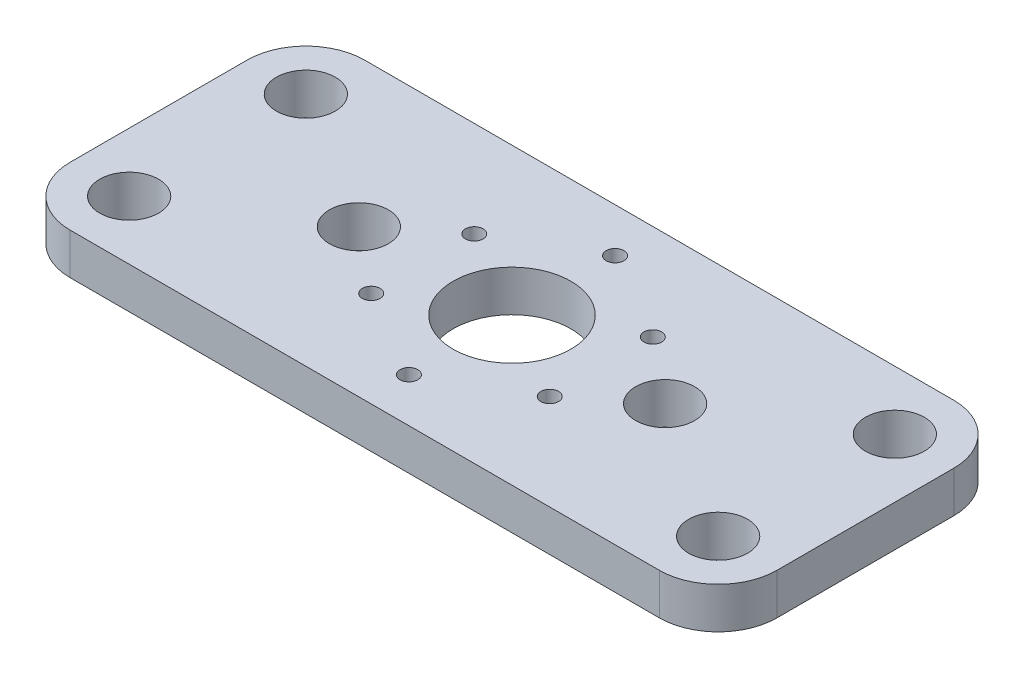
ISO-10303-21;
HEADER;
FILE_DESCRIPTION(('STEP AP214'),'2;1');
FILE_NAME('part.step','',(''),(''),'','','');
FILE_SCHEMA(('AUTOMOTIVE_DESIGN { 1 0 10303 214 1 1 1 1 }'));
ENDSEC;
DATA;
#1=APPLICATION_CONTEXT('core data for automotive mechanical design processes');
#2=APPLICATION_PROTOCOL_DEFINITION('international standard','automotive_design',2000,#1);
#3=PRODUCT_CONTEXT('',#1,'mechanical');
#4=PRODUCT('Part','Part','',(#3));
#5=PRODUCT_RELATED_PRODUCT_CATEGORY('part','',(#4));
#6=PRODUCT_DEFINITION_FORMATION('','',#4);
#7=PRODUCT_DEFINITION_CONTEXT('part definition',#1,'design');
#8=PRODUCT_DEFINITION('design','',#6,#7);
#9=PRODUCT_DEFINITION_SHAPE('','',#8);
#10=(LENGTH_UNIT() NAMED_UNIT(*) SI_UNIT(.MILLI.,.METRE.));
#11=(NAMED_UNIT(*) PLANE_ANGLE_UNIT() SI_UNIT($,.RADIAN.));
#12=(NAMED_UNIT(*) SI_UNIT($,.STERADIAN.) SOLID_ANGLE_UNIT());
#13=UNCERTAINTY_MEASURE_WITH_UNIT(LENGTH_MEASURE(1.E-05),#10,'distance_accuracy_value','');
#14=(GEOMETRIC_REPRESENTATION_CONTEXT(3) GLOBAL_UNCERTAINTY_ASSIGNED_CONTEXT((#13)) GLOBAL_UNIT_ASSIGNED_CONTEXT((#10,
#11,#12)) REPRESENTATION_CONTEXT('',''));
#15=CARTESIAN_POINT('',(0.,0.,0.));
#16=DIRECTION('',(0.,0.,1.));
#17=DIRECTION('',(1.,0.,0.));
#18=AXIS2_PLACEMENT_3D('',#15,#16,#17);
#19=CARTESIAN_POINT('',(50.,7.,15.));
#20=DIRECTION('',(0.,1.,0.));
#21=DIRECTION('',(0.,0.,1.));
#22=AXIS2_PLACEMENT_3D('',#19,#20,#21);
#23=PLANE('',#22);
#24=CARTESIAN_POINT('',(-15.1554445662278,7.,8.74999999999986));
#25=DIRECTION('',(0.,1.,0.));
#26=DIRECTION('',(0.,0.,1.));
#27=AXIS2_PLACEMENT_3D('',#24,#25,#26);
#28=CIRCLE('',#27,1.5);
#29=CARTESIAN_POINT('',(-15.1554445662278,7.,10.2499999999999));
#30=VERTEX_POINT('',#29);
#31=EDGE_CURVE('E246',#30,#30,#28,.T.);
#32=ORIENTED_EDGE('',*,*,#31,.F.);
#33=EDGE_LOOP('',(#32));
#34=FACE_BOUND('',#33,.T.);
#35=CARTESIAN_POINT('',(15.1554445662278,7.,8.75000000000038));
#36=DIRECTION('',(0.,1.,0.));
#37=DIRECTION('',(0.,0.,1.));
#38=AXIS2_PLACEMENT_3D('',#35,#36,#37);
#39=CIRCLE('',#38,1.49999999999973);
#40=CARTESIAN_POINT('',(15.1554445662278,7.,10.2500000000001));
#41=VERTEX_POINT('',#40);
#42=EDGE_CURVE('E234',#41,#41,#39,.T.);
#43=ORIENTED_EDGE('',*,*,#42,.F.);
#44=EDGE_LOOP('',(#43));
#45=FACE_BOUND('',#44,.T.);
#46=CARTESIAN_POINT('',(50.,7.,-15.));
#47=DIRECTION('',(0.,1.,0.));
#48=DIRECTION('',(0.,0.,1.));
#49=AXIS2_PLACEMENT_3D('',#46,#47,#48);
#50=CIRCLE('',#49,5.);
#51=CARTESIAN_POINT('',(50.,7.,-9.99999999999999));
#52=VERTEX_POINT('',#51);
#53=EDGE_CURVE('E222',#52,#52,#50,.T.);
#54=ORIENTED_EDGE('',*,*,#53,.F.);
#55=EDGE_LOOP('',(#54));
#56=FACE_BOUND('',#55,.T.);
#57=CARTESIAN_POINT('',(-49.9999999999171,7.,15.));
#58=DIRECTION('',(0.,1.,0.));
#59=DIRECTION('',(0.,0.,1.));
#60=AXIS2_PLACEMENT_3D('',#57,#58,#59);
#61=CIRCLE('',#60,5.);
#62=CARTESIAN_POINT('',(-49.9999999999171,7.,20.));
#63=VERTEX_POINT('',#62);
#64=EDGE_CURVE('E210',#63,#63,#61,.T.);
#65=ORIENTED_EDGE('',*,*,#64,.F.);
#66=EDGE_LOOP('',(#65));
#67=FACE_BOUND('',#66,.T.);
#68=CARTESIAN_POINT('',(26.,7.,0.));
#69=DIRECTION('',(0.,1.,0.));
#70=DIRECTION('',(0.,0.,1.));
#71=AXIS2_PLACEMENT_3D('',#68,#69,#70);
#72=CIRCLE('',#71,5.);
#73=CARTESIAN_POINT('',(26.,7.,5.));
#74=VERTEX_POINT('',#73);
#75=EDGE_CURVE('E198',#74,#74,#72,.T.);
#76=ORIENTED_EDGE('',*,*,#75,.F.);
#77=EDGE_LOOP('',(#76));
#78=FACE_BOUND('',#77,.T.);
#79=CARTESIAN_POINT('',(0.,7.,-17.5));
#80=DIRECTION('',(0.,1.,0.));
#81=DIRECTION('',(0.,0.,1.));
#82=AXIS2_PLACEMENT_3D('',#79,#80,#81);
#83=CIRCLE('',#82,1.5);
#84=CARTESIAN_POINT('',(0.,7.,-16.));
#85=VERTEX_POINT('',#84);
#86=EDGE_CURVE('E186',#85,#85,#83,.T.);
#87=ORIENTED_EDGE('',*,*,#86,.F.);
#88=EDGE_LOOP('',(#87));
#89=FACE_BOUND('',#88,.T.);
#90=CARTESIAN_POINT('',(50.,7.,15.));
#91=DIRECTION('',(0.,1.,0.));
#92=DIRECTION('',(0.,0.,1.));
#93=AXIS2_PLACEMENT_3D('',#90,#91,#92);
#94=CIRCLE('',#93,10.);
#95=CARTESIAN_POINT('',(50.,7.,25.));
#96=VERTEX_POINT('',#95);
#97=CARTESIAN_POINT('',(60.,7.,14.9999999999999));
#98=VERTEX_POINT('',#97);
#99=EDGE_CURVE('E149',#96,#98,#94,.T.);
#100=ORIENTED_EDGE('',*,*,#99,.T.);
#101=DIRECTION('',(0.,0.,-1.));
#102=VECTOR('',#101,1.);
#103=CARTESIAN_POINT('',(60.,7.,14.9999999999999));
#104=LINE('',#103,#102);
#105=CARTESIAN_POINT('',(60.,7.,-14.9999999999999));
#106=VERTEX_POINT('',#105);
#107=EDGE_CURVE('E97',#98,#106,#104,.T.);
#108=ORIENTED_EDGE('',*,*,#107,.T.);
#109=CARTESIAN_POINT('',(50.,7.,-15.));
#110=DIRECTION('',(0.,1.,0.));
#111=DIRECTION('',(0.,0.,-1.));
#112=AXIS2_PLACEMENT_3D('',#109,#110,#111);
#113=CIRCLE('',#112,10.);
#114=CARTESIAN_POINT('',(50.,7.,-25.));
#115=VERTEX_POINT('',#114);
#116=EDGE_CURVE('E164',#106,#115,#113,.T.);
#117=ORIENTED_EDGE('',*,*,#116,.T.);
#118=DIRECTION('',(-1.,0.,0.));
#119=VECTOR('',#118,1.);
#120=CARTESIAN_POINT('',(-49.9999999999999,7.,-25.));
#121=LINE('',#120,#119);
#122=CARTESIAN_POINT('',(-50.,7.,-25.));
#123=VERTEX_POINT('',#122);
#124=EDGE_CURVE('E177',#115,#123,#121,.T.);
#125=ORIENTED_EDGE('',*,*,#124,.T.);
#126=CARTESIAN_POINT('',(-50.,7.,-15.));
#127=DIRECTION('',(0.,1.,0.));
#128=DIRECTION('',(0.,0.,-1.));
#129=AXIS2_PLACEMENT_3D('',#126,#127,#128);
#130=CIRCLE('',#129,10.);
#131=CARTESIAN_POINT('',(-60.,7.,-14.9999999999999));
#132=VERTEX_POINT('',#131);
#133=EDGE_CURVE('E116',#123,#132,#130,.T.);
#134=ORIENTED_EDGE('',*,*,#133,.T.);
#135=DIRECTION('',(0.,0.,1.));
#136=VECTOR('',#135,1.);
#137=CARTESIAN_POINT('',(-60.,7.,14.9999999999999));
#138=LINE('',#137,#136);
#139=CARTESIAN_POINT('',(-60.,7.,14.9999999999999));
#140=VERTEX_POINT('',#139);
#141=EDGE_CURVE('E110',#132,#140,#138,.T.);
#142=ORIENTED_EDGE('',*,*,#141,.T.);
#143=CARTESIAN_POINT('',(-50.,7.,15.));
#144=DIRECTION('',(0.,1.,0.));
#145=DIRECTION('',(0.,0.,-1.));
#146=AXIS2_PLACEMENT_3D('',#143,#144,#145);
#147=CIRCLE('',#146,10.);
#148=CARTESIAN_POINT('',(-49.9999999999999,7.,25.));
#149=VERTEX_POINT('',#148);
#150=EDGE_CURVE('E114',#140,#149,#147,.T.);
#151=ORIENTED_EDGE('',*,*,#150,.T.);
#152=DIRECTION('',(1.,0.,0.));
#153=VECTOR('',#152,1.);
#154=CARTESIAN_POINT('',(-49.9999999999999,7.,25.));
#155=LINE('',#154,#153);
#156=EDGE_CURVE('E54',#149,#96,#155,.T.);
#157=ORIENTED_EDGE('',*,*,#156,.T.);
#158=EDGE_LOOP('',(#100,#108,#117,#125,#134,#142,#151,#157));
#159=FACE_BOUND('',#158,.T.);
#160=CARTESIAN_POINT('',(0.,7.,0.));
#161=DIRECTION('',(0.,1.,0.));
#162=DIRECTION('',(0.,0.,1.));
#163=AXIS2_PLACEMENT_3D('',#160,#161,#162);
#164=CIRCLE('',#163,10.);
#165=CARTESIAN_POINT('',(0.,7.,10.));
#166=VERTEX_POINT('',#165);
#167=EDGE_CURVE('E138',#166,#166,#164,.T.);
#168=ORIENTED_EDGE('',*,*,#167,.F.);
#169=EDGE_LOOP('',(#168));
#170=FACE_BOUND('',#169,.T.);
#171=CARTESIAN_POINT('',(-26.,7.,0.));
#172=DIRECTION('',(0.,1.,0.));
#173=DIRECTION('',(0.,0.,1.));
#174=AXIS2_PLACEMENT_3D('',#171,#172,#173);
#175=CIRCLE('',#174,5.);
#176=CARTESIAN_POINT('',(-26.,7.,5.));
#177=VERTEX_POINT('',#176);
#178=EDGE_CURVE('E192',#177,#177,#175,.T.);
#179=ORIENTED_EDGE('',*,*,#178,.F.);
#180=EDGE_LOOP('',(#179));
#181=FACE_BOUND('',#180,.T.);
#182=CARTESIAN_POINT('',(-50.,7.,-15.));
#183=DIRECTION('',(0.,1.,0.));
#184=DIRECTION('',(0.,0.,1.));
#185=AXIS2_PLACEMENT_3D('',#182,#183,#184);
#186=CIRCLE('',#185,5.);
#187=CARTESIAN_POINT('',(-50.,7.,-10.));
#188=VERTEX_POINT('',#187);
#189=EDGE_CURVE('E204',#188,#188,#186,.T.);
#190=ORIENTED_EDGE('',*,*,#189,.F.);
#191=EDGE_LOOP('',(#190));
#192=FACE_BOUND('',#191,.T.);
#193=CARTESIAN_POINT('',(50.,7.,15.));
#194=DIRECTION('',(0.,1.,0.));
#195=DIRECTION('',(0.,0.,1.));
#196=AXIS2_PLACEMENT_3D('',#193,#194,#195);
#197=CIRCLE('',#196,5.);
#198=CARTESIAN_POINT('',(50.,7.,20.));
#199=VERTEX_POINT('',#198);
#200=EDGE_CURVE('E216',#199,#199,#197,.T.);
#201=ORIENTED_EDGE('',*,*,#200,.F.);
#202=EDGE_LOOP('',(#201));
#203=FACE_BOUND('',#202,.T.);
#204=CARTESIAN_POINT('',(15.1554445662277,7.,-8.74999999999963));
#205=DIRECTION('',(0.,1.,0.));
#206=DIRECTION('',(0.,0.,1.));
#207=AXIS2_PLACEMENT_3D('',#204,#205,#206);
#208=CIRCLE('',#207,1.49999999999977);
#209=CARTESIAN_POINT('',(15.1554445662277,7.,-7.24999999999986));
#210=VERTEX_POINT('',#209);
#211=EDGE_CURVE('E228',#210,#210,#208,.T.);
#212=ORIENTED_EDGE('',*,*,#211,.F.);
#213=EDGE_LOOP('',(#212));
#214=FACE_BOUND('',#213,.T.);
#215=CARTESIAN_POINT('',(0.,7.,17.5000000000004));
#216=DIRECTION('',(0.,1.,0.));
#217=DIRECTION('',(0.,0.,1.));
#218=AXIS2_PLACEMENT_3D('',#215,#216,#217);
#219=CIRCLE('',#218,1.50000000000009);
#220=CARTESIAN_POINT('',(0.,7.,19.0000000000005));
#221=VERTEX_POINT('',#220);
#222=EDGE_CURVE('E240',#221,#221,#219,.T.);
#223=ORIENTED_EDGE('',*,*,#222,.F.);
#224=EDGE_LOOP('',(#223));
#225=FACE_BOUND('',#224,.T.);
#226=CARTESIAN_POINT('',(-15.1554445662277,7.,-8.74999999999953));
#227=DIRECTION('',(0.,1.,0.));
#228=DIRECTION('',(0.,0.,1.));
#229=AXIS2_PLACEMENT_3D('',#226,#227,#228);
#230=CIRCLE('',#229,1.50000000000065);
#231=CARTESIAN_POINT('',(-15.1554445662277,7.,-7.24999999999887));
#232=VERTEX_POINT('',#231);
#233=EDGE_CURVE('E252',#232,#232,#230,.T.);
#234=ORIENTED_EDGE('',*,*,#233,.F.);
#235=EDGE_LOOP('',(#234));
#236=FACE_BOUND('',#235,.T.);
#237=ADVANCED_FACE('F37',(#34,#45,#56,#67,#78,#89,#159,#170,#181,#192,#203,#214,#225,#236),#23,.T.);
#238=CARTESIAN_POINT('',(50.,0.,15.));
#239=DIRECTION('',(0.,1.,0.));
#240=DIRECTION('',(0.,0.,1.));
#241=AXIS2_PLACEMENT_3D('',#238,#239,#240);
#242=PLANE('',#241);
#243=CARTESIAN_POINT('',(50.,0.,15.));
#244=DIRECTION('',(0.,1.,0.));
#245=DIRECTION('',(0.,0.,1.));
#246=AXIS2_PLACEMENT_3D('',#243,#244,#245);
#247=CIRCLE('',#246,10.);
#248=CARTESIAN_POINT('',(50.,0.,25.));
#249=VERTEX_POINT('',#248);
#250=CARTESIAN_POINT('',(60.,0.,14.9999999999999));
#251=VERTEX_POINT('',#250);
#252=EDGE_CURVE('E134',#249,#251,#247,.T.);
#253=ORIENTED_EDGE('',*,*,#252,.F.);
#254=DIRECTION('',(1.,0.,0.));
#255=VECTOR('',#254,1.);
#256=CARTESIAN_POINT('',(-49.9999999999999,0.,25.));
#257=LINE('',#256,#255);
#258=CARTESIAN_POINT('',(-49.9999999999999,0.,25.));
#259=VERTEX_POINT('',#258);
#260=EDGE_CURVE('E89',#259,#249,#257,.T.);
#261=ORIENTED_EDGE('',*,*,#260,.F.);
#262=CARTESIAN_POINT('',(-50.,0.,15.));
#263=DIRECTION('',(0.,1.,0.));
#264=DIRECTION('',(0.,0.,-1.));
#265=AXIS2_PLACEMENT_3D('',#262,#263,#264);
#266=CIRCLE('',#265,10.);
#267=CARTESIAN_POINT('',(-60.,0.,14.9999999999999));
#268=VERTEX_POINT('',#267);
#269=EDGE_CURVE('E83',#268,#259,#266,.T.);
#270=ORIENTED_EDGE('',*,*,#269,.F.);
#271=DIRECTION('',(0.,0.,1.));
#272=VECTOR('',#271,1.);
#273=CARTESIAN_POINT('',(-60.,0.,14.9999999999999));
#274=LINE('',#273,#272);
#275=CARTESIAN_POINT('',(-60.,0.,-14.9999999999999));
#276=VERTEX_POINT('',#275);
#277=EDGE_CURVE('E124',#276,#268,#274,.T.);
#278=ORIENTED_EDGE('',*,*,#277,.F.);
#279=CARTESIAN_POINT('',(-50.,0.,-15.));
#280=DIRECTION('',(0.,1.,0.));
#281=DIRECTION('',(0.,0.,-1.));
#282=AXIS2_PLACEMENT_3D('',#279,#280,#281);
#283=CIRCLE('',#282,10.);
#284=CARTESIAN_POINT('',(-50.,0.,-25.));
#285=VERTEX_POINT('',#284);
#286=EDGE_CURVE('E144',#285,#276,#283,.T.);
#287=ORIENTED_EDGE('',*,*,#286,.F.);
#288=DIRECTION('',(-1.,0.,0.));
#289=VECTOR('',#288,1.);
#290=CARTESIAN_POINT('',(-49.9999999999999,0.,-25.));
#291=LINE('',#290,#289);
#292=CARTESIAN_POINT('',(50.,0.,-25.));
#293=VERTEX_POINT('',#292);
#294=EDGE_CURVE('E142',#293,#285,#291,.T.);
#295=ORIENTED_EDGE('',*,*,#294,.F.);
#296=CARTESIAN_POINT('',(50.,0.,-15.));
#297=DIRECTION('',(0.,1.,0.));
#298=DIRECTION('',(0.,0.,-1.));
#299=AXIS2_PLACEMENT_3D('',#296,#297,#298);
#300=CIRCLE('',#299,10.);
#301=CARTESIAN_POINT('',(60.,0.,-14.9999999999999));
#302=VERTEX_POINT('',#301);
#303=EDGE_CURVE('E140',#302,#293,#300,.T.);
#304=ORIENTED_EDGE('',*,*,#303,.F.);
#305=DIRECTION('',(0.,0.,-1.));
#306=VECTOR('',#305,1.);
#307=CARTESIAN_POINT('',(60.,0.,14.9999999999999));
#308=LINE('',#307,#306);
#309=EDGE_CURVE('E137',#251,#302,#308,.T.);
#310=ORIENTED_EDGE('',*,*,#309,.F.);
#311=EDGE_LOOP('',(#253,#261,#270,#278,#287,#295,#304,#310));
#312=FACE_BOUND('',#311,.T.);
#313=CARTESIAN_POINT('',(0.,0.,0.));
#314=DIRECTION('',(0.,1.,0.));
#315=DIRECTION('',(0.,0.,1.));
#316=AXIS2_PLACEMENT_3D('',#313,#314,#315);
#317=CIRCLE('',#316,10.);
#318=CARTESIAN_POINT('',(0.,0.,10.));
#319=VERTEX_POINT('',#318);
#320=EDGE_CURVE('E183',#319,#319,#317,.T.);
#321=ORIENTED_EDGE('',*,*,#320,.T.);
#322=EDGE_LOOP('',(#321));
#323=FACE_BOUND('',#322,.T.);
#324=CARTESIAN_POINT('',(0.,0.,-17.5));
#325=DIRECTION('',(0.,1.,0.));
#326=DIRECTION('',(0.,0.,1.));
#327=AXIS2_PLACEMENT_3D('',#324,#325,#326);
#328=CIRCLE('',#327,1.5);
#329=CARTESIAN_POINT('',(0.,0.,-16.));
#330=VERTEX_POINT('',#329);
#331=EDGE_CURVE('E189',#330,#330,#328,.T.);
#332=ORIENTED_EDGE('',*,*,#331,.T.);
#333=EDGE_LOOP('',(#332));
#334=FACE_BOUND('',#333,.T.);
#335=CARTESIAN_POINT('',(-26.,0.,0.));
#336=DIRECTION('',(0.,1.,0.));
#337=DIRECTION('',(0.,0.,1.));
#338=AXIS2_PLACEMENT_3D('',#335,#336,#337);
#339=CIRCLE('',#338,5.);
#340=CARTESIAN_POINT('',(-26.,0.,5.));
#341=VERTEX_POINT('',#340);
#342=EDGE_CURVE('E195',#341,#341,#339,.T.);
#343=ORIENTED_EDGE('',*,*,#342,.T.);
#344=EDGE_LOOP('',(#343));
#345=FACE_BOUND('',#344,.T.);
#346=CARTESIAN_POINT('',(26.,0.,0.));
#347=DIRECTION('',(0.,1.,0.));
#348=DIRECTION('',(0.,0.,1.));
#349=AXIS2_PLACEMENT_3D('',#346,#347,#348);
#350=CIRCLE('',#349,5.);
#351=CARTESIAN_POINT('',(26.,0.,5.));
#352=VERTEX_POINT('',#351);
#353=EDGE_CURVE('E201',#352,#352,#350,.T.);
#354=ORIENTED_EDGE('',*,*,#353,.T.);
#355=EDGE_LOOP('',(#354));
#356=FACE_BOUND('',#355,.T.);
#357=CARTESIAN_POINT('',(-50.,0.,-15.));
#358=DIRECTION('',(0.,1.,0.));
#359=DIRECTION('',(0.,0.,1.));
#360=AXIS2_PLACEMENT_3D('',#357,#358,#359);
#361=CIRCLE('',#360,5.);
#362=CARTESIAN_POINT('',(-50.,0.,-10.));
#363=VERTEX_POINT('',#362);
#364=EDGE_CURVE('E207',#363,#363,#361,.T.);
#365=ORIENTED_EDGE('',*,*,#364,.T.);
#366=EDGE_LOOP('',(#365));
#367=FACE_BOUND('',#366,.T.);
#368=CARTESIAN_POINT('',(-49.9999999999171,0.,15.));
#369=DIRECTION('',(0.,1.,0.));
#370=DIRECTION('',(0.,0.,1.));
#371=AXIS2_PLACEMENT_3D('',#368,#369,#370);
#372=CIRCLE('',#371,5.);
#373=CARTESIAN_POINT('',(-49.9999999999171,0.,20.));
#374=VERTEX_POINT('',#373);
#375=EDGE_CURVE('E213',#374,#374,#372,.T.);
#376=ORIENTED_EDGE('',*,*,#375,.T.);
#377=EDGE_LOOP('',(#376));
#378=FACE_BOUND('',#377,.T.);
#379=CARTESIAN_POINT('',(50.,0.,15.));
#380=DIRECTION('',(0.,1.,0.));
#381=DIRECTION('',(0.,0.,1.));
#382=AXIS2_PLACEMENT_3D('',#379,#380,#381);
#383=CIRCLE('',#382,5.);
#384=CARTESIAN_POINT('',(50.,0.,20.));
#385=VERTEX_POINT('',#384);
#386=EDGE_CURVE('E219',#385,#385,#383,.T.);
#387=ORIENTED_EDGE('',*,*,#386,.T.);
#388=EDGE_LOOP('',(#387));
#389=FACE_BOUND('',#388,.T.);
#390=CARTESIAN_POINT('',(50.,0.,-15.));
#391=DIRECTION('',(0.,1.,0.));
#392=DIRECTION('',(0.,0.,1.));
#393=AXIS2_PLACEMENT_3D('',#390,#391,#392);
#394=CIRCLE('',#393,5.);
#395=CARTESIAN_POINT('',(50.,0.,-9.99999999999999));
#396=VERTEX_POINT('',#395);
#397=EDGE_CURVE('E225',#396,#396,#394,.T.);
#398=ORIENTED_EDGE('',*,*,#397,.T.);
#399=EDGE_LOOP('',(#398));
#400=FACE_BOUND('',#399,.T.);
#401=CARTESIAN_POINT('',(15.1554445662277,0.,-8.74999999999963));
#402=DIRECTION('',(0.,1.,0.));
#403=DIRECTION('',(0.,0.,1.));
#404=AXIS2_PLACEMENT_3D('',#401,#402,#403);
#405=CIRCLE('',#404,1.49999999999977);
#406=CARTESIAN_POINT('',(15.1554445662277,0.,-7.24999999999986));
#407=VERTEX_POINT('',#406);
#408=EDGE_CURVE('E231',#407,#407,#405,.T.);
#409=ORIENTED_EDGE('',*,*,#408,.T.);
#410=EDGE_LOOP('',(#409));
#411=FACE_BOUND('',#410,.T.);
#412=CARTESIAN_POINT('',(15.1554445662278,0.,8.75000000000038));
#413=DIRECTION('',(0.,1.,0.));
#414=DIRECTION('',(0.,0.,1.));
#415=AXIS2_PLACEMENT_3D('',#412,#413,#414);
#416=CIRCLE('',#415,1.49999999999973);
#417=CARTESIAN_POINT('',(15.1554445662278,0.,10.2500000000001));
#418=VERTEX_POINT('',#417);
#419=EDGE_CURVE('E237',#418,#418,#416,.T.);
#420=ORIENTED_EDGE('',*,*,#419,.T.);
#421=EDGE_LOOP('',(#420));
#422=FACE_BOUND('',#421,.T.);
#423=CARTESIAN_POINT('',(0.,0.,17.5000000000004));
#424=DIRECTION('',(0.,1.,0.));
#425=DIRECTION('',(0.,0.,1.));
#426=AXIS2_PLACEMENT_3D('',#423,#424,#425);
#427=CIRCLE('',#426,1.50000000000009);
#428=CARTESIAN_POINT('',(0.,0.,19.0000000000005));
#429=VERTEX_POINT('',#428);
#430=EDGE_CURVE('E243',#429,#429,#427,.T.);
#431=ORIENTED_EDGE('',*,*,#430,.T.);
#432=EDGE_LOOP('',(#431));
#433=FACE_BOUND('',#432,.T.);
#434=CARTESIAN_POINT('',(-15.1554445662278,0.,8.74999999999986));
#435=DIRECTION('',(0.,1.,0.));
#436=DIRECTION('',(0.,0.,1.));
#437=AXIS2_PLACEMENT_3D('',#434,#435,#436);
#438=CIRCLE('',#437,1.5);
#439=CARTESIAN_POINT('',(-15.1554445662278,0.,10.2499999999999));
#440=VERTEX_POINT('',#439);
#441=EDGE_CURVE('E249',#440,#440,#438,.T.);
#442=ORIENTED_EDGE('',*,*,#441,.T.);
#443=EDGE_LOOP('',(#442));
#444=FACE_BOUND('',#443,.T.);
#445=CARTESIAN_POINT('',(-15.1554445662277,0.,-8.74999999999953));
#446=DIRECTION('',(0.,1.,0.));
#447=DIRECTION('',(0.,0.,1.));
#448=AXIS2_PLACEMENT_3D('',#445,#446,#447);
#449=CIRCLE('',#448,1.50000000000065);
#450=CARTESIAN_POINT('',(-15.1554445662277,0.,-7.24999999999887));
#451=VERTEX_POINT('',#450);
#452=EDGE_CURVE('E255',#451,#451,#449,.T.);
#453=ORIENTED_EDGE('',*,*,#452,.T.);
#454=EDGE_LOOP('',(#453));
#455=FACE_BOUND('',#454,.T.);
#456=ADVANCED_FACE('F168',(#312,#323,#334,#345,#356,#367,#378,#389,#400,#411,#422,#433,#444,
#455),#242,.F.);
#457=CARTESIAN_POINT('',(50.,7.,15.));
#458=DIRECTION('',(0.,-1.,0.));
#459=DIRECTION('',(0.,0.,-1.));
#460=AXIS2_PLACEMENT_3D('',#457,#458,#459);
#461=CYLINDRICAL_SURFACE('',#460,10.);
#462=ORIENTED_EDGE('',*,*,#252,.T.);
#463=DIRECTION('',(0.,-1.,0.));
#464=VECTOR('',#463,1.);
#465=CARTESIAN_POINT('',(60.,7.,14.9999999999999));
#466=LINE('',#465,#464);
#467=EDGE_CURVE('E11',#98,#251,#466,.T.);
#468=ORIENTED_EDGE('',*,*,#467,.F.);
#469=ORIENTED_EDGE('',*,*,#99,.F.);
#470=DIRECTION('',(0.,-1.,0.));
#471=VECTOR('',#470,1.);
#472=CARTESIAN_POINT('',(50.,7.,25.));
#473=LINE('',#472,#471);
#474=EDGE_CURVE('E130',#96,#249,#473,.T.);
#475=ORIENTED_EDGE('',*,*,#474,.T.);
#476=EDGE_LOOP('',(#462,#468,#469,#475));
#477=FACE_BOUND('',#476,.T.);
#478=ADVANCED_FACE('F39',(#477),#461,.T.);
#479=CARTESIAN_POINT('',(60.,7.,14.9999999999999));
#480=DIRECTION('',(-1.,0.,0.));
#481=DIRECTION('',(0.,0.,1.));
#482=AXIS2_PLACEMENT_3D('',#479,#480,#481);
#483=PLANE('',#482);
#484=ORIENTED_EDGE('',*,*,#309,.T.);
#485=DIRECTION('',(0.,-1.,0.));
#486=VECTOR('',#485,1.);
#487=CARTESIAN_POINT('',(60.,7.,-14.9999999999999));
#488=LINE('',#487,#486);
#489=EDGE_CURVE('E46',#106,#302,#488,.T.);
#490=ORIENTED_EDGE('',*,*,#489,.F.);
#491=ORIENTED_EDGE('',*,*,#107,.F.);
#492=ORIENTED_EDGE('',*,*,#467,.T.);
#493=EDGE_LOOP('',(#484,#490,#491,#492));
#494=FACE_BOUND('',#493,.T.);
#495=ADVANCED_FACE('F289',(#494),#483,.F.);
#496=CARTESIAN_POINT('',(50.,7.,-15.));
#497=DIRECTION('',(0.,-1.,0.));
#498=DIRECTION('',(0.,0.,-1.));
#499=AXIS2_PLACEMENT_3D('',#496,#497,#498);
#500=CYLINDRICAL_SURFACE('',#499,10.);
#501=ORIENTED_EDGE('',*,*,#303,.T.);
#502=DIRECTION('',(0.,-1.,0.));
#503=VECTOR('',#502,1.);
#504=CARTESIAN_POINT('',(50.,7.,-25.));
#505=LINE('',#504,#503);
#506=EDGE_CURVE('E156',#115,#293,#505,.T.);
#507=ORIENTED_EDGE('',*,*,#506,.F.);
#508=ORIENTED_EDGE('',*,*,#116,.F.);
#509=ORIENTED_EDGE('',*,*,#489,.T.);
#510=EDGE_LOOP('',(#501,#507,#508,#509));
#511=FACE_BOUND('',#510,.T.);
#512=ADVANCED_FACE('F162',(#511),#500,.T.);
#513=CARTESIAN_POINT('',(-49.9999999999999,7.,-25.));
#514=DIRECTION('',(0.,0.,1.));
#515=DIRECTION('',(1.,0.,0.));
#516=AXIS2_PLACEMENT_3D('',#513,#514,#515);
#517=PLANE('',#516);
#518=ORIENTED_EDGE('',*,*,#294,.T.);
#519=DIRECTION('',(0.,-1.,0.));
#520=VECTOR('',#519,1.);
#521=CARTESIAN_POINT('',(-50.,7.,-25.));
#522=LINE('',#521,#520);
#523=EDGE_CURVE('E153',#123,#285,#522,.T.);
#524=ORIENTED_EDGE('',*,*,#523,.F.);
#525=ORIENTED_EDGE('',*,*,#124,.F.);
#526=ORIENTED_EDGE('',*,*,#506,.T.);
#527=EDGE_LOOP('',(#518,#524,#525,#526));
#528=FACE_BOUND('',#527,.T.);
#529=ADVANCED_FACE('F173',(#528),#517,.F.);
#530=CARTESIAN_POINT('',(-50.,7.,-15.));
#531=DIRECTION('',(0.,-1.,0.));
#532=DIRECTION('',(0.,0.,-1.));
#533=AXIS2_PLACEMENT_3D('',#530,#531,#532);
#534=CYLINDRICAL_SURFACE('',#533,10.);
#535=ORIENTED_EDGE('',*,*,#286,.T.);
#536=DIRECTION('',(0.,-1.,0.));
#537=VECTOR('',#536,1.);
#538=CARTESIAN_POINT('',(-60.,7.,-14.9999999999999));
#539=LINE('',#538,#537);
#540=EDGE_CURVE('E125',#132,#276,#539,.T.);
#541=ORIENTED_EDGE('',*,*,#540,.F.);
#542=ORIENTED_EDGE('',*,*,#133,.F.);
#543=ORIENTED_EDGE('',*,*,#523,.T.);
#544=EDGE_LOOP('',(#535,#541,#542,#543));
#545=FACE_BOUND('',#544,.T.);
#546=ADVANCED_FACE('F176',(#545),#534,.T.);
#547=CARTESIAN_POINT('',(-60.,7.,14.9999999999999));
#548=DIRECTION('',(1.,0.,0.));
#549=DIRECTION('',(0.,0.,-1.));
#550=AXIS2_PLACEMENT_3D('',#547,#548,#549);
#551=PLANE('',#550);
#552=ORIENTED_EDGE('',*,*,#277,.T.);
#553=DIRECTION('',(0.,-1.,0.));
#554=VECTOR('',#553,1.);
#555=CARTESIAN_POINT('',(-60.,7.,14.9999999999999));
#556=LINE('',#555,#554);
#557=EDGE_CURVE('E121',#140,#268,#556,.T.);
#558=ORIENTED_EDGE('',*,*,#557,.F.);
#559=ORIENTED_EDGE('',*,*,#141,.F.);
#560=ORIENTED_EDGE('',*,*,#540,.T.);
#561=EDGE_LOOP('',(#552,#558,#559,#560));
#562=FACE_BOUND('',#561,.T.);
#563=ADVANCED_FACE('F122',(#562),#551,.F.);
#564=CARTESIAN_POINT('',(-50.,7.,15.));
#565=DIRECTION('',(0.,-1.,0.));
#566=DIRECTION('',(0.,0.,-1.));
#567=AXIS2_PLACEMENT_3D('',#564,#565,#566);
#568=CYLINDRICAL_SURFACE('',#567,10.);
#569=ORIENTED_EDGE('',*,*,#269,.T.);
#570=DIRECTION('',(0.,-1.,0.));
#571=VECTOR('',#570,1.);
#572=CARTESIAN_POINT('',(-49.9999999999999,7.,25.));
#573=LINE('',#572,#571);
#574=EDGE_CURVE('E126',#149,#259,#573,.T.);
#575=ORIENTED_EDGE('',*,*,#574,.F.);
#576=ORIENTED_EDGE('',*,*,#150,.F.);
#577=ORIENTED_EDGE('',*,*,#557,.T.);
#578=EDGE_LOOP('',(#569,#575,#576,#577));
#579=FACE_BOUND('',#578,.T.);
#580=ADVANCED_FACE('F128',(#579),#568,.T.);
#581=CARTESIAN_POINT('',(-49.9999999999999,7.,25.));
#582=DIRECTION('',(0.,0.,-1.));
#583=DIRECTION('',(-1.,0.,0.));
#584=AXIS2_PLACEMENT_3D('',#581,#582,#583);
#585=PLANE('',#584);
#586=ORIENTED_EDGE('',*,*,#260,.T.);
#587=ORIENTED_EDGE('',*,*,#474,.F.);
#588=ORIENTED_EDGE('',*,*,#156,.F.);
#589=ORIENTED_EDGE('',*,*,#574,.T.);
#590=EDGE_LOOP('',(#586,#587,#588,#589));
#591=FACE_BOUND('',#590,.T.);
#592=ADVANCED_FACE('F277',(#591),#585,.F.);
#593=CARTESIAN_POINT('',(0.,7.,0.));
#594=DIRECTION('',(0.,-1.,0.));
#595=DIRECTION('',(0.,0.,-1.));
#596=AXIS2_PLACEMENT_3D('',#593,#594,#595);
#597=CYLINDRICAL_SURFACE('',#596,10.);
#598=ORIENTED_EDGE('',*,*,#167,.T.);
#599=EDGE_LOOP('',(#598));
#600=FACE_BOUND('',#599,.T.);
#601=ORIENTED_EDGE('',*,*,#320,.F.);
#602=EDGE_LOOP('',(#601));
#603=FACE_BOUND('',#602,.T.);
#604=ADVANCED_FACE('F274',(#600,#603),#597,.F.);
#605=CARTESIAN_POINT('',(0.,7.,-17.5));
#606=DIRECTION('',(0.,-1.,0.));
#607=DIRECTION('',(0.,0.,-1.));
#608=AXIS2_PLACEMENT_3D('',#605,#606,#607);
#609=CYLINDRICAL_SURFACE('',#608,1.5);
#610=ORIENTED_EDGE('',*,*,#86,.T.);
#611=EDGE_LOOP('',(#610));
#612=FACE_BOUND('',#611,.T.);
#613=ORIENTED_EDGE('',*,*,#331,.F.);
#614=EDGE_LOOP('',(#613));
#615=FACE_BOUND('',#614,.T.);
#616=ADVANCED_FACE('F365',(#612,#615),#609,.F.);
#617=CARTESIAN_POINT('',(-26.,7.,0.));
#618=DIRECTION('',(0.,-1.,0.));
#619=DIRECTION('',(0.,0.,-1.));
#620=AXIS2_PLACEMENT_3D('',#617,#618,#619);
#621=CYLINDRICAL_SURFACE('',#620,5.);
#622=ORIENTED_EDGE('',*,*,#178,.T.);
#623=EDGE_LOOP('',(#622));
#624=FACE_BOUND('',#623,.T.);
#625=ORIENTED_EDGE('',*,*,#342,.F.);
#626=EDGE_LOOP('',(#625));
#627=FACE_BOUND('',#626,.T.);
#628=ADVANCED_FACE('F374',(#624,#627),#621,.F.);
#629=CARTESIAN_POINT('',(26.,7.,0.));
#630=DIRECTION('',(0.,-1.,0.));
#631=DIRECTION('',(0.,0.,-1.));
#632=AXIS2_PLACEMENT_3D('',#629,#630,#631);
#633=CYLINDRICAL_SURFACE('',#632,5.);
#634=ORIENTED_EDGE('',*,*,#75,.T.);
#635=EDGE_LOOP('',(#634));
#636=FACE_BOUND('',#635,.T.);
#637=ORIENTED_EDGE('',*,*,#353,.F.);
#638=EDGE_LOOP('',(#637));
#639=FACE_BOUND('',#638,.T.);
#640=ADVANCED_FACE('F383',(#636,#639),#633,.F.);
#641=CARTESIAN_POINT('',(-50.,7.,-15.));
#642=DIRECTION('',(0.,-1.,0.));
#643=DIRECTION('',(0.,0.,-1.));
#644=AXIS2_PLACEMENT_3D('',#641,#642,#643);
#645=CYLINDRICAL_SURFACE('',#644,5.);
#646=ORIENTED_EDGE('',*,*,#189,.T.);
#647=EDGE_LOOP('',(#646));
#648=FACE_BOUND('',#647,.T.);
#649=ORIENTED_EDGE('',*,*,#364,.F.);
#650=EDGE_LOOP('',(#649));
#651=FACE_BOUND('',#650,.T.);
#652=ADVANCED_FACE('F393',(#648,#651),#645,.F.);
#653=CARTESIAN_POINT('',(-49.9999999999171,7.,15.));
#654=DIRECTION('',(0.,-1.,0.));
#655=DIRECTION('',(0.,0.,-1.));
#656=AXIS2_PLACEMENT_3D('',#653,#654,#655);
#657=CYLINDRICAL_SURFACE('',#656,5.);
#658=ORIENTED_EDGE('',*,*,#64,.T.);
#659=EDGE_LOOP('',(#658));
#660=FACE_BOUND('',#659,.T.);
#661=ORIENTED_EDGE('',*,*,#375,.F.);
#662=EDGE_LOOP('',(#661));
#663=FACE_BOUND('',#662,.T.);
#664=ADVANCED_FACE('F403',(#660,#663),#657,.F.);
#665=CARTESIAN_POINT('',(50.,7.,15.));
#666=DIRECTION('',(0.,-1.,0.));
#667=DIRECTION('',(0.,0.,-1.));
#668=AXIS2_PLACEMENT_3D('',#665,#666,#667);
#669=CYLINDRICAL_SURFACE('',#668,5.);
#670=ORIENTED_EDGE('',*,*,#200,.T.);
#671=EDGE_LOOP('',(#670));
#672=FACE_BOUND('',#671,.T.);
#673=ORIENTED_EDGE('',*,*,#386,.F.);
#674=EDGE_LOOP('',(#673));
#675=FACE_BOUND('',#674,.T.);
#676=ADVANCED_FACE('F413',(#672,#675),#669,.F.);
#677=CARTESIAN_POINT('',(50.,7.,-15.));
#678=DIRECTION('',(0.,-1.,0.));
#679=DIRECTION('',(0.,0.,-1.));
#680=AXIS2_PLACEMENT_3D('',#677,#678,#679);
#681=CYLINDRICAL_SURFACE('',#680,5.);
#682=ORIENTED_EDGE('',*,*,#53,.T.);
#683=EDGE_LOOP('',(#682));
#684=FACE_BOUND('',#683,.T.);
#685=ORIENTED_EDGE('',*,*,#397,.F.);
#686=EDGE_LOOP('',(#685));
#687=FACE_BOUND('',#686,.T.);
#688=ADVANCED_FACE('F423',(#684,#687),#681,.F.);
#689=CARTESIAN_POINT('',(15.1554445662277,7.,-8.74999999999963));
#690=DIRECTION('',(0.,-1.,0.));
#691=DIRECTION('',(0.,0.,-1.));
#692=AXIS2_PLACEMENT_3D('',#689,#690,#691);
#693=CYLINDRICAL_SURFACE('',#692,1.49999999999977);
#694=ORIENTED_EDGE('',*,*,#211,.T.);
#695=EDGE_LOOP('',(#694));
#696=FACE_BOUND('',#695,.T.);
#697=ORIENTED_EDGE('',*,*,#408,.F.);
#698=EDGE_LOOP('',(#697));
#699=FACE_BOUND('',#698,.T.);
#700=ADVANCED_FACE('F433',(#696,#699),#693,.F.);
#701=CARTESIAN_POINT('',(15.1554445662278,7.,8.75000000000038));
#702=DIRECTION('',(0.,-1.,0.));
#703=DIRECTION('',(0.,0.,-1.));
#704=AXIS2_PLACEMENT_3D('',#701,#702,#703);
#705=CYLINDRICAL_SURFACE('',#704,1.49999999999973);
#706=ORIENTED_EDGE('',*,*,#42,.T.);
#707=EDGE_LOOP('',(#706));
#708=FACE_BOUND('',#707,.T.);
#709=ORIENTED_EDGE('',*,*,#419,.F.);
#710=EDGE_LOOP('',(#709));
#711=FACE_BOUND('',#710,.T.);
#712=ADVANCED_FACE('F443',(#708,#711),#705,.F.);
#713=CARTESIAN_POINT('',(0.,7.,17.5000000000004));
#714=DIRECTION('',(0.,-1.,0.));
#715=DIRECTION('',(0.,0.,-1.));
#716=AXIS2_PLACEMENT_3D('',#713,#714,#715);
#717=CYLINDRICAL_SURFACE('',#716,1.50000000000009);
#718=ORIENTED_EDGE('',*,*,#222,.T.);
#719=EDGE_LOOP('',(#718));
#720=FACE_BOUND('',#719,.T.);
#721=ORIENTED_EDGE('',*,*,#430,.F.);
#722=EDGE_LOOP('',(#721));
#723=FACE_BOUND('',#722,.T.);
#724=ADVANCED_FACE('F453',(#720,#723),#717,.F.);
#725=CARTESIAN_POINT('',(-15.1554445662278,7.,8.74999999999986));
#726=DIRECTION('',(0.,-1.,0.));
#727=DIRECTION('',(0.,0.,-1.));
#728=AXIS2_PLACEMENT_3D('',#725,#726,#727);
#729=CYLINDRICAL_SURFACE('',#728,1.5);
#730=ORIENTED_EDGE('',*,*,#31,.T.);
#731=EDGE_LOOP('',(#730));
#732=FACE_BOUND('',#731,.T.);
#733=ORIENTED_EDGE('',*,*,#441,.F.);
#734=EDGE_LOOP('',(#733));
#735=FACE_BOUND('',#734,.T.);
#736=ADVANCED_FACE('F463',(#732,#735),#729,.F.);
#737=CARTESIAN_POINT('',(-15.1554445662277,7.,-8.74999999999953));
#738=DIRECTION('',(0.,-1.,0.));
#739=DIRECTION('',(0.,0.,-1.));
#740=AXIS2_PLACEMENT_3D('',#737,#738,#739);
#741=CYLINDRICAL_SURFACE('',#740,1.50000000000065);
#742=ORIENTED_EDGE('',*,*,#233,.T.);
#743=EDGE_LOOP('',(#742));
#744=FACE_BOUND('',#743,.T.);
#745=ORIENTED_EDGE('',*,*,#452,.F.);
#746=EDGE_LOOP('',(#745));
#747=FACE_BOUND('',#746,.T.);
#748=ADVANCED_FACE('F261',(#744,#747),#741,.F.);
#749=CLOSED_SHELL('',(#237,#456,#478,#495,#512,#529,#546,#563,#580,#592,#604,#616,#628,#640,
#652,#664,#676,#688,#700,#712,#724,#736,#748));
#750=MANIFOLD_SOLID_BREP('B2',#749);
#751=ADVANCED_BREP_SHAPE_REPRESENTATION('',(#18,#750),#14);
#752=SHAPE_DEFINITION_REPRESENTATION(#9,#751);
ENDSEC;
END-ISO-10303-21;
